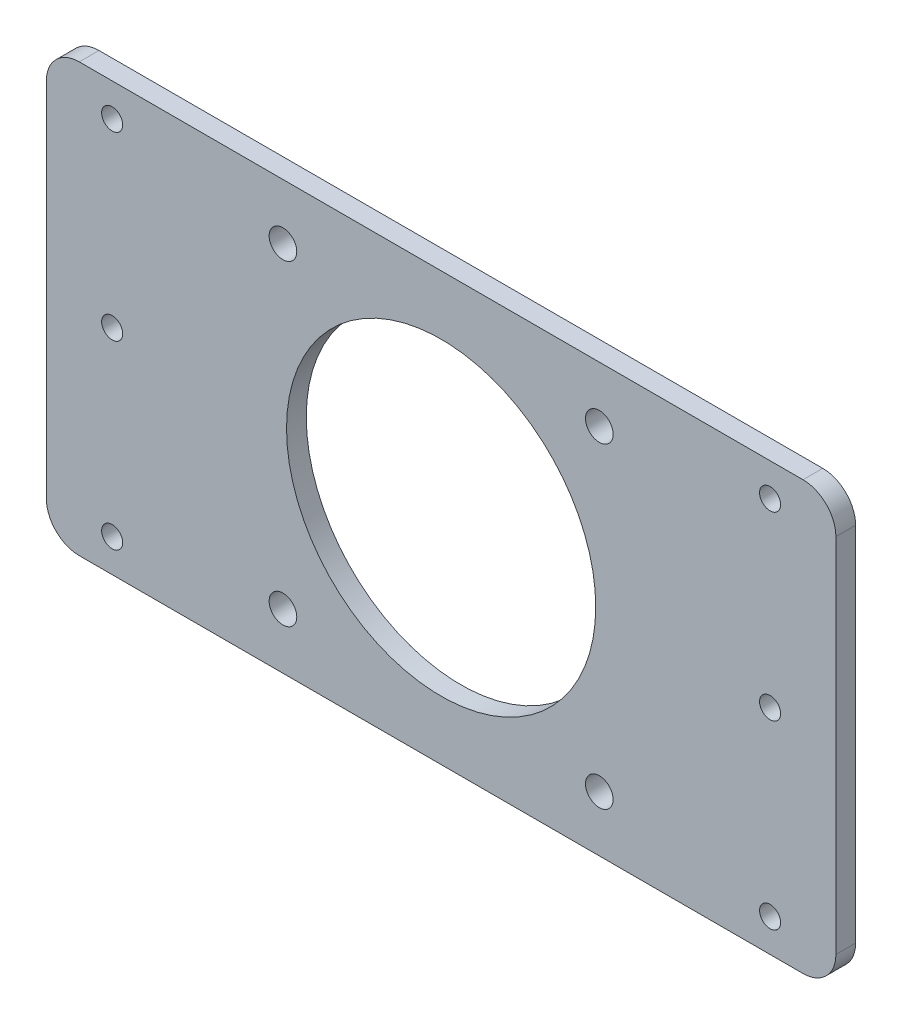
ISO-10303-21;
HEADER;
FILE_DESCRIPTION(('STEP AP214'),'2;1');
FILE_NAME('part.step','',(''),(''),'','','');
FILE_SCHEMA(('AUTOMOTIVE_DESIGN { 1 0 10303 214 1 1 1 1 }'));
ENDSEC;
DATA;
#1=APPLICATION_CONTEXT('core data for automotive mechanical design processes');
#2=APPLICATION_PROTOCOL_DEFINITION('international standard','automotive_design',2000,#1);
#3=PRODUCT_CONTEXT('',#1,'mechanical');
#4=PRODUCT('Part','Part','',(#3));
#5=PRODUCT_RELATED_PRODUCT_CATEGORY('part','',(#4));
#6=PRODUCT_DEFINITION_FORMATION('','',#4);
#7=PRODUCT_DEFINITION_CONTEXT('part definition',#1,'design');
#8=PRODUCT_DEFINITION('design','',#6,#7);
#9=PRODUCT_DEFINITION_SHAPE('','',#8);
#10=(LENGTH_UNIT() NAMED_UNIT(*) SI_UNIT(.MILLI.,.METRE.));
#11=(NAMED_UNIT(*) PLANE_ANGLE_UNIT() SI_UNIT($,.RADIAN.));
#12=(NAMED_UNIT(*) SI_UNIT($,.STERADIAN.) SOLID_ANGLE_UNIT());
#13=UNCERTAINTY_MEASURE_WITH_UNIT(LENGTH_MEASURE(1.E-05),#10,'distance_accuracy_value','');
#14=(GEOMETRIC_REPRESENTATION_CONTEXT(3) GLOBAL_UNCERTAINTY_ASSIGNED_CONTEXT((#13)) GLOBAL_UNIT_ASSIGNED_CONTEXT((#10,
#11,#12)) REPRESENTATION_CONTEXT('',''));
#15=CARTESIAN_POINT('',(0.,0.,0.));
#16=DIRECTION('',(0.,0.,1.));
#17=DIRECTION('',(1.,0.,0.));
#18=AXIS2_PLACEMENT_3D('',#15,#16,#17);
#19=CARTESIAN_POINT('',(0.,0.,3.));
#20=DIRECTION('',(1.,0.,0.));
#21=DIRECTION('',(0.,0.,-1.));
#22=AXIS2_PLACEMENT_3D('',#19,#20,#21);
#23=PLANE('',#22);
#24=DIRECTION('',(0.,-1.,0.));
#25=VECTOR('',#24,1.);
#26=CARTESIAN_POINT('',(0.,0.,0.));
#27=LINE('',#26,#25);
#28=CARTESIAN_POINT('',(0.,-5.,0.));
#29=VERTEX_POINT('',#28);
#30=CARTESIAN_POINT('',(0.,-60.,0.));
#31=VERTEX_POINT('',#30);
#32=EDGE_CURVE('E228',#29,#31,#27,.T.);
#33=ORIENTED_EDGE('',*,*,#32,.T.);
#34=DIRECTION('',(0.,0.,-1.));
#35=VECTOR('',#34,1.);
#36=CARTESIAN_POINT('',(0.,-60.,3.));
#37=LINE('',#36,#35);
#38=CARTESIAN_POINT('',(0.,-60.,3.));
#39=VERTEX_POINT('',#38);
#40=EDGE_CURVE('E11',#31,#39,#37,.F.);
#41=ORIENTED_EDGE('',*,*,#40,.T.);
#42=DIRECTION('',(0.,-1.,0.));
#43=VECTOR('',#42,1.);
#44=CARTESIAN_POINT('',(0.,0.,3.));
#45=LINE('',#44,#43);
#46=CARTESIAN_POINT('',(0.,-5.,3.));
#47=VERTEX_POINT('',#46);
#48=EDGE_CURVE('E135',#47,#39,#45,.T.);
#49=ORIENTED_EDGE('',*,*,#48,.F.);
#50=DIRECTION('',(0.,0.,-1.));
#51=VECTOR('',#50,1.);
#52=CARTESIAN_POINT('',(0.,-5.,3.));
#53=LINE('',#52,#51);
#54=EDGE_CURVE('E50',#47,#29,#53,.T.);
#55=ORIENTED_EDGE('',*,*,#54,.T.);
#56=EDGE_LOOP('',(#33,#41,#49,#55));
#57=FACE_BOUND('',#56,.T.);
#58=ADVANCED_FACE('F41',(#57),#23,.F.);
#59=CARTESIAN_POINT('',(0.,-65.,3.));
#60=DIRECTION('',(0.,1.,0.));
#61=DIRECTION('',(0.,0.,1.));
#62=AXIS2_PLACEMENT_3D('',#59,#60,#61);
#63=PLANE('',#62);
#64=DIRECTION('',(1.,0.,0.));
#65=VECTOR('',#64,1.);
#66=CARTESIAN_POINT('',(0.,-65.,0.));
#67=LINE('',#66,#65);
#68=CARTESIAN_POINT('',(5.,-65.,0.));
#69=VERTEX_POINT('',#68);
#70=CARTESIAN_POINT('',(115.,-65.,0.));
#71=VERTEX_POINT('',#70);
#72=EDGE_CURVE('E140',#69,#71,#67,.T.);
#73=ORIENTED_EDGE('',*,*,#72,.T.);
#74=DIRECTION('',(0.,0.,-1.));
#75=VECTOR('',#74,1.);
#76=CARTESIAN_POINT('',(115.,-65.,3.));
#77=LINE('',#76,#75);
#78=CARTESIAN_POINT('',(115.,-65.,3.));
#79=VERTEX_POINT('',#78);
#80=EDGE_CURVE('E58',#71,#79,#77,.F.);
#81=ORIENTED_EDGE('',*,*,#80,.T.);
#82=DIRECTION('',(1.,0.,0.));
#83=VECTOR('',#82,1.);
#84=CARTESIAN_POINT('',(0.,-65.,3.));
#85=LINE('',#84,#83);
#86=CARTESIAN_POINT('',(5.,-65.,3.));
#87=VERTEX_POINT('',#86);
#88=EDGE_CURVE('E138',#87,#79,#85,.T.);
#89=ORIENTED_EDGE('',*,*,#88,.F.);
#90=DIRECTION('',(0.,0.,-1.));
#91=VECTOR('',#90,1.);
#92=CARTESIAN_POINT('',(5.,-65.,3.));
#93=LINE('',#92,#91);
#94=EDGE_CURVE('E159',#87,#69,#93,.T.);
#95=ORIENTED_EDGE('',*,*,#94,.T.);
#96=EDGE_LOOP('',(#73,#81,#89,#95));
#97=FACE_BOUND('',#96,.T.);
#98=ADVANCED_FACE('F238',(#97),#63,.F.);
#99=CARTESIAN_POINT('',(120.,0.,3.));
#100=DIRECTION('',(-1.,0.,0.));
#101=DIRECTION('',(0.,-1.,0.));
#102=AXIS2_PLACEMENT_3D('',#99,#100,#101);
#103=PLANE('',#102);
#104=DIRECTION('',(0.,1.,0.));
#105=VECTOR('',#104,1.);
#106=CARTESIAN_POINT('',(120.,0.,0.));
#107=LINE('',#106,#105);
#108=CARTESIAN_POINT('',(120.,-60.,0.));
#109=VERTEX_POINT('',#108);
#110=CARTESIAN_POINT('',(120.,-5.,0.));
#111=VERTEX_POINT('',#110);
#112=EDGE_CURVE('E136',#109,#111,#107,.T.);
#113=ORIENTED_EDGE('',*,*,#112,.T.);
#114=DIRECTION('',(0.,0.,-1.));
#115=VECTOR('',#114,1.);
#116=CARTESIAN_POINT('',(120.,-5.,3.));
#117=LINE('',#116,#115);
#118=CARTESIAN_POINT('',(120.,-5.,3.));
#119=VERTEX_POINT('',#118);
#120=EDGE_CURVE('E114',#111,#119,#117,.F.);
#121=ORIENTED_EDGE('',*,*,#120,.T.);
#122=DIRECTION('',(0.,1.,0.));
#123=VECTOR('',#122,1.);
#124=CARTESIAN_POINT('',(120.,0.,3.));
#125=LINE('',#124,#123);
#126=CARTESIAN_POINT('',(120.,-60.,3.));
#127=VERTEX_POINT('',#126);
#128=EDGE_CURVE('E232',#127,#119,#125,.T.);
#129=ORIENTED_EDGE('',*,*,#128,.F.);
#130=DIRECTION('',(0.,0.,-1.));
#131=VECTOR('',#130,1.);
#132=CARTESIAN_POINT('',(120.,-60.,3.));
#133=LINE('',#132,#131);
#134=EDGE_CURVE('E119',#127,#109,#133,.T.);
#135=ORIENTED_EDGE('',*,*,#134,.T.);
#136=EDGE_LOOP('',(#113,#121,#129,#135));
#137=FACE_BOUND('',#136,.T.);
#138=ADVANCED_FACE('F247',(#137),#103,.F.);
#139=CARTESIAN_POINT('',(0.,0.,3.));
#140=DIRECTION('',(0.,-1.,0.));
#141=DIRECTION('',(0.,0.,-1.));
#142=AXIS2_PLACEMENT_3D('',#139,#140,#141);
#143=PLANE('',#142);
#144=DIRECTION('',(-1.,0.,0.));
#145=VECTOR('',#144,1.);
#146=CARTESIAN_POINT('',(0.,0.,3.));
#147=LINE('',#146,#145);
#148=CARTESIAN_POINT('',(115.,0.,3.));
#149=VERTEX_POINT('',#148);
#150=CARTESIAN_POINT('',(5.,0.,3.));
#151=VERTEX_POINT('',#150);
#152=EDGE_CURVE('E129',#149,#151,#147,.T.);
#153=ORIENTED_EDGE('',*,*,#152,.F.);
#154=DIRECTION('',(0.,0.,-1.));
#155=VECTOR('',#154,1.);
#156=CARTESIAN_POINT('',(115.,0.,3.));
#157=LINE('',#156,#155);
#158=CARTESIAN_POINT('',(115.,0.,0.));
#159=VERTEX_POINT('',#158);
#160=EDGE_CURVE('E113',#149,#159,#157,.T.);
#161=ORIENTED_EDGE('',*,*,#160,.T.);
#162=DIRECTION('',(-1.,0.,0.));
#163=VECTOR('',#162,1.);
#164=CARTESIAN_POINT('',(0.,0.,0.));
#165=LINE('',#164,#163);
#166=CARTESIAN_POINT('',(5.,0.,0.));
#167=VERTEX_POINT('',#166);
#168=EDGE_CURVE('E126',#159,#167,#165,.T.);
#169=ORIENTED_EDGE('',*,*,#168,.T.);
#170=DIRECTION('',(0.,0.,-1.));
#171=VECTOR('',#170,1.);
#172=CARTESIAN_POINT('',(5.,0.,3.));
#173=LINE('',#172,#171);
#174=EDGE_CURVE('E131',#167,#151,#173,.F.);
#175=ORIENTED_EDGE('',*,*,#174,.T.);
#176=EDGE_LOOP('',(#153,#161,#169,#175));
#177=FACE_BOUND('',#176,.T.);
#178=ADVANCED_FACE('F125',(#177),#143,.F.);
#179=CARTESIAN_POINT('',(0.,0.,3.));
#180=DIRECTION('',(0.,0.,1.));
#181=DIRECTION('',(1.,0.,0.));
#182=AXIS2_PLACEMENT_3D('',#179,#180,#181);
#183=PLANE('',#182);
#184=CARTESIAN_POINT('',(35.9583694396573,-8.45836943965745,3.));
#185=DIRECTION('',(0.,0.,1.));
#186=DIRECTION('',(1.,0.,0.));
#187=AXIS2_PLACEMENT_3D('',#184,#185,#186);
#188=CIRCLE('',#187,2.1);
#189=CARTESIAN_POINT('',(38.0583694396573,-8.45836943965745,3.));
#190=VERTEX_POINT('',#189);
#191=EDGE_CURVE('E190',#190,#190,#188,.T.);
#192=ORIENTED_EDGE('',*,*,#191,.F.);
#193=EDGE_LOOP('',(#192));
#194=FACE_BOUND('',#193,.T.);
#195=CARTESIAN_POINT('',(35.9583694396574,-56.5416305603427,3.));
#196=DIRECTION('',(0.,0.,1.));
#197=DIRECTION('',(1.,0.,0.));
#198=AXIS2_PLACEMENT_3D('',#195,#196,#197);
#199=CIRCLE('',#198,2.1);
#200=CARTESIAN_POINT('',(38.0583694396574,-56.5416305603427,3.));
#201=VERTEX_POINT('',#200);
#202=EDGE_CURVE('E179',#201,#201,#199,.T.);
#203=ORIENTED_EDGE('',*,*,#202,.F.);
#204=EDGE_LOOP('',(#203));
#205=FACE_BOUND('',#204,.T.);
#206=CARTESIAN_POINT('',(84.0416305603427,-56.5416305603426,3.));
#207=DIRECTION('',(0.,0.,1.));
#208=DIRECTION('',(1.,0.,0.));
#209=AXIS2_PLACEMENT_3D('',#206,#207,#208);
#210=CIRCLE('',#209,2.1);
#211=CARTESIAN_POINT('',(86.1416305603427,-56.5416305603426,3.));
#212=VERTEX_POINT('',#211);
#213=EDGE_CURVE('E176',#212,#212,#210,.T.);
#214=ORIENTED_EDGE('',*,*,#213,.F.);
#215=EDGE_LOOP('',(#214));
#216=FACE_BOUND('',#215,.T.);
#217=CARTESIAN_POINT('',(84.0416305603426,-8.45836943965735,3.));
#218=DIRECTION('',(0.,0.,1.));
#219=DIRECTION('',(1.,0.,0.));
#220=AXIS2_PLACEMENT_3D('',#217,#218,#219);
#221=CIRCLE('',#220,2.10000000000002);
#222=CARTESIAN_POINT('',(86.1416305603426,-8.45836943965735,3.));
#223=VERTEX_POINT('',#222);
#224=EDGE_CURVE('E173',#223,#223,#221,.T.);
#225=ORIENTED_EDGE('',*,*,#224,.F.);
#226=EDGE_LOOP('',(#225));
#227=FACE_BOUND('',#226,.T.);
#228=CARTESIAN_POINT('',(60.,-32.5,3.));
#229=DIRECTION('',(0.,0.,1.));
#230=DIRECTION('',(1.,0.,0.));
#231=AXIS2_PLACEMENT_3D('',#228,#229,#230);
#232=CIRCLE('',#231,23.5);
#233=CARTESIAN_POINT('',(83.5,-32.5,3.));
#234=VERTEX_POINT('',#233);
#235=EDGE_CURVE('E169',#234,#234,#232,.T.);
#236=ORIENTED_EDGE('',*,*,#235,.F.);
#237=EDGE_LOOP('',(#236));
#238=FACE_BOUND('',#237,.T.);
#239=CARTESIAN_POINT('',(110.,-5.00000000000001,3.));
#240=DIRECTION('',(0.,0.,1.));
#241=DIRECTION('',(-1.,0.,0.));
#242=AXIS2_PLACEMENT_3D('',#239,#240,#241);
#243=CIRCLE('',#242,1.59999999999999);
#244=CARTESIAN_POINT('',(108.4,-5.00000000000001,3.));
#245=VERTEX_POINT('',#244);
#246=EDGE_CURVE('E220',#245,#245,#243,.T.);
#247=ORIENTED_EDGE('',*,*,#246,.F.);
#248=EDGE_LOOP('',(#247));
#249=FACE_BOUND('',#248,.T.);
#250=CARTESIAN_POINT('',(110.,-32.5,3.));
#251=DIRECTION('',(0.,0.,1.));
#252=DIRECTION('',(-1.,0.,0.));
#253=AXIS2_PLACEMENT_3D('',#250,#251,#252);
#254=CIRCLE('',#253,1.59999999999999);
#255=CARTESIAN_POINT('',(108.4,-32.5,3.));
#256=VERTEX_POINT('',#255);
#257=EDGE_CURVE('E214',#256,#256,#254,.T.);
#258=ORIENTED_EDGE('',*,*,#257,.F.);
#259=EDGE_LOOP('',(#258));
#260=FACE_BOUND('',#259,.T.);
#261=CARTESIAN_POINT('',(110.,-60.,3.));
#262=DIRECTION('',(0.,0.,1.));
#263=DIRECTION('',(-1.,0.,0.));
#264=AXIS2_PLACEMENT_3D('',#261,#262,#263);
#265=CIRCLE('',#264,1.6);
#266=CARTESIAN_POINT('',(108.4,-60.,3.));
#267=VERTEX_POINT('',#266);
#268=EDGE_CURVE('E208',#267,#267,#265,.T.);
#269=ORIENTED_EDGE('',*,*,#268,.F.);
#270=EDGE_LOOP('',(#269));
#271=FACE_BOUND('',#270,.T.);
#272=CARTESIAN_POINT('',(10.,-60.,3.));
#273=DIRECTION('',(0.,0.,1.));
#274=DIRECTION('',(1.,0.,0.));
#275=AXIS2_PLACEMENT_3D('',#272,#273,#274);
#276=CIRCLE('',#275,1.6);
#277=CARTESIAN_POINT('',(11.6,-60.,3.));
#278=VERTEX_POINT('',#277);
#279=EDGE_CURVE('E202',#278,#278,#276,.T.);
#280=ORIENTED_EDGE('',*,*,#279,.F.);
#281=EDGE_LOOP('',(#280));
#282=FACE_BOUND('',#281,.T.);
#283=CARTESIAN_POINT('',(10.,-32.5,3.));
#284=DIRECTION('',(0.,0.,1.));
#285=DIRECTION('',(1.,0.,0.));
#286=AXIS2_PLACEMENT_3D('',#283,#284,#285);
#287=CIRCLE('',#286,1.6);
#288=CARTESIAN_POINT('',(11.6,-32.5,3.));
#289=VERTEX_POINT('',#288);
#290=EDGE_CURVE('E195',#289,#289,#287,.T.);
#291=ORIENTED_EDGE('',*,*,#290,.F.);
#292=EDGE_LOOP('',(#291));
#293=FACE_BOUND('',#292,.T.);
#294=CARTESIAN_POINT('',(10.,-5.,3.));
#295=DIRECTION('',(0.,0.,1.));
#296=DIRECTION('',(1.,0.,0.));
#297=AXIS2_PLACEMENT_3D('',#294,#295,#296);
#298=CIRCLE('',#297,1.6);
#299=CARTESIAN_POINT('',(11.6,-5.,3.));
#300=VERTEX_POINT('',#299);
#301=EDGE_CURVE('E198',#300,#300,#298,.T.);
#302=ORIENTED_EDGE('',*,*,#301,.F.);
#303=EDGE_LOOP('',(#302));
#304=FACE_BOUND('',#303,.T.);
#305=ORIENTED_EDGE('',*,*,#128,.T.);
#306=CARTESIAN_POINT('',(115.,-5.,3.));
#307=DIRECTION('',(0.,0.,1.));
#308=DIRECTION('',(1.,0.,0.));
#309=AXIS2_PLACEMENT_3D('',#306,#307,#308);
#310=CIRCLE('',#309,5.);
#311=EDGE_CURVE('E157',#119,#149,#310,.T.);
#312=ORIENTED_EDGE('',*,*,#311,.T.);
#313=ORIENTED_EDGE('',*,*,#152,.T.);
#314=CARTESIAN_POINT('',(5.,-5.,3.));
#315=DIRECTION('',(0.,0.,1.));
#316=DIRECTION('',(1.,0.,0.));
#317=AXIS2_PLACEMENT_3D('',#314,#315,#316);
#318=CIRCLE('',#317,5.);
#319=EDGE_CURVE('E152',#151,#47,#318,.T.);
#320=ORIENTED_EDGE('',*,*,#319,.T.);
#321=ORIENTED_EDGE('',*,*,#48,.T.);
#322=CARTESIAN_POINT('',(5.,-60.,3.));
#323=DIRECTION('',(0.,0.,1.));
#324=DIRECTION('',(1.,0.,0.));
#325=AXIS2_PLACEMENT_3D('',#322,#323,#324);
#326=CIRCLE('',#325,5.);
#327=EDGE_CURVE('E65',#39,#87,#326,.T.);
#328=ORIENTED_EDGE('',*,*,#327,.T.);
#329=ORIENTED_EDGE('',*,*,#88,.T.);
#330=CARTESIAN_POINT('',(115.,-60.,3.));
#331=DIRECTION('',(0.,0.,1.));
#332=DIRECTION('',(1.,0.,0.));
#333=AXIS2_PLACEMENT_3D('',#330,#331,#332);
#334=CIRCLE('',#333,5.);
#335=EDGE_CURVE('E155',#79,#127,#334,.T.);
#336=ORIENTED_EDGE('',*,*,#335,.T.);
#337=EDGE_LOOP('',(#305,#312,#313,#320,#321,#328,#329,#336));
#338=FACE_BOUND('',#337,.T.);
#339=ADVANCED_FACE('F245',(#194,#205,#216,#227,#238,#249,#260,#271,#282,#293,#304,#338),#183,.T.);
#340=CARTESIAN_POINT('',(0.,0.,0.));
#341=DIRECTION('',(0.,0.,1.));
#342=DIRECTION('',(1.,0.,0.));
#343=AXIS2_PLACEMENT_3D('',#340,#341,#342);
#344=PLANE('',#343);
#345=CARTESIAN_POINT('',(35.9583694396573,-8.45836943965745,0.));
#346=DIRECTION('',(0.,0.,1.));
#347=DIRECTION('',(1.,0.,0.));
#348=AXIS2_PLACEMENT_3D('',#345,#346,#347);
#349=CIRCLE('',#348,2.1);
#350=CARTESIAN_POINT('',(38.0583694396573,-8.45836943965745,0.));
#351=VERTEX_POINT('',#350);
#352=EDGE_CURVE('E45',#351,#351,#349,.T.);
#353=ORIENTED_EDGE('',*,*,#352,.T.);
#354=EDGE_LOOP('',(#353));
#355=FACE_BOUND('',#354,.T.);
#356=CARTESIAN_POINT('',(35.9583694396574,-56.5416305603427,0.));
#357=DIRECTION('',(0.,0.,1.));
#358=DIRECTION('',(1.,0.,0.));
#359=AXIS2_PLACEMENT_3D('',#356,#357,#358);
#360=CIRCLE('',#359,2.1);
#361=CARTESIAN_POINT('',(38.0583694396574,-56.5416305603427,0.));
#362=VERTEX_POINT('',#361);
#363=EDGE_CURVE('E177',#362,#362,#360,.T.);
#364=ORIENTED_EDGE('',*,*,#363,.T.);
#365=EDGE_LOOP('',(#364));
#366=FACE_BOUND('',#365,.T.);
#367=CARTESIAN_POINT('',(84.0416305603427,-56.5416305603426,0.));
#368=DIRECTION('',(0.,0.,1.));
#369=DIRECTION('',(1.,0.,0.));
#370=AXIS2_PLACEMENT_3D('',#367,#368,#369);
#371=CIRCLE('',#370,2.1);
#372=CARTESIAN_POINT('',(86.1416305603427,-56.5416305603426,0.));
#373=VERTEX_POINT('',#372);
#374=EDGE_CURVE('E174',#373,#373,#371,.T.);
#375=ORIENTED_EDGE('',*,*,#374,.T.);
#376=EDGE_LOOP('',(#375));
#377=FACE_BOUND('',#376,.T.);
#378=CARTESIAN_POINT('',(84.0416305603426,-8.45836943965735,0.));
#379=DIRECTION('',(0.,0.,1.));
#380=DIRECTION('',(1.,0.,0.));
#381=AXIS2_PLACEMENT_3D('',#378,#379,#380);
#382=CIRCLE('',#381,2.10000000000002);
#383=CARTESIAN_POINT('',(86.1416305603426,-8.45836943965735,0.));
#384=VERTEX_POINT('',#383);
#385=EDGE_CURVE('E170',#384,#384,#382,.T.);
#386=ORIENTED_EDGE('',*,*,#385,.T.);
#387=EDGE_LOOP('',(#386));
#388=FACE_BOUND('',#387,.T.);
#389=CARTESIAN_POINT('',(60.,-32.5,0.));
#390=DIRECTION('',(0.,0.,1.));
#391=DIRECTION('',(1.,0.,0.));
#392=AXIS2_PLACEMENT_3D('',#389,#390,#391);
#393=CIRCLE('',#392,23.5);
#394=CARTESIAN_POINT('',(83.5,-32.5,0.));
#395=VERTEX_POINT('',#394);
#396=EDGE_CURVE('E165',#395,#395,#393,.T.);
#397=ORIENTED_EDGE('',*,*,#396,.T.);
#398=EDGE_LOOP('',(#397));
#399=FACE_BOUND('',#398,.T.);
#400=CARTESIAN_POINT('',(110.,-5.00000000000001,0.));
#401=DIRECTION('',(0.,0.,1.));
#402=DIRECTION('',(-1.,0.,0.));
#403=AXIS2_PLACEMENT_3D('',#400,#401,#402);
#404=CIRCLE('',#403,1.59999999999999);
#405=CARTESIAN_POINT('',(108.4,-5.00000000000001,0.));
#406=VERTEX_POINT('',#405);
#407=EDGE_CURVE('E168',#406,#406,#404,.T.);
#408=ORIENTED_EDGE('',*,*,#407,.T.);
#409=EDGE_LOOP('',(#408));
#410=FACE_BOUND('',#409,.T.);
#411=CARTESIAN_POINT('',(110.,-32.5,0.));
#412=DIRECTION('',(0.,0.,1.));
#413=DIRECTION('',(-1.,0.,0.));
#414=AXIS2_PLACEMENT_3D('',#411,#412,#413);
#415=CIRCLE('',#414,1.59999999999999);
#416=CARTESIAN_POINT('',(108.4,-32.5,0.));
#417=VERTEX_POINT('',#416);
#418=EDGE_CURVE('E217',#417,#417,#415,.T.);
#419=ORIENTED_EDGE('',*,*,#418,.T.);
#420=EDGE_LOOP('',(#419));
#421=FACE_BOUND('',#420,.T.);
#422=CARTESIAN_POINT('',(110.,-60.,0.));
#423=DIRECTION('',(0.,0.,1.));
#424=DIRECTION('',(-1.,0.,0.));
#425=AXIS2_PLACEMENT_3D('',#422,#423,#424);
#426=CIRCLE('',#425,1.6);
#427=CARTESIAN_POINT('',(108.4,-60.,0.));
#428=VERTEX_POINT('',#427);
#429=EDGE_CURVE('E211',#428,#428,#426,.T.);
#430=ORIENTED_EDGE('',*,*,#429,.T.);
#431=EDGE_LOOP('',(#430));
#432=FACE_BOUND('',#431,.T.);
#433=CARTESIAN_POINT('',(10.,-60.,0.));
#434=DIRECTION('',(0.,0.,1.));
#435=DIRECTION('',(1.,0.,0.));
#436=AXIS2_PLACEMENT_3D('',#433,#434,#435);
#437=CIRCLE('',#436,1.6);
#438=CARTESIAN_POINT('',(11.6,-60.,0.));
#439=VERTEX_POINT('',#438);
#440=EDGE_CURVE('E205',#439,#439,#437,.T.);
#441=ORIENTED_EDGE('',*,*,#440,.T.);
#442=EDGE_LOOP('',(#441));
#443=FACE_BOUND('',#442,.T.);
#444=CARTESIAN_POINT('',(10.,-32.5,0.));
#445=DIRECTION('',(0.,0.,1.));
#446=DIRECTION('',(1.,0.,0.));
#447=AXIS2_PLACEMENT_3D('',#444,#445,#446);
#448=CIRCLE('',#447,1.6);
#449=CARTESIAN_POINT('',(11.6,-32.5,0.));
#450=VERTEX_POINT('',#449);
#451=EDGE_CURVE('E199',#450,#450,#448,.T.);
#452=ORIENTED_EDGE('',*,*,#451,.T.);
#453=EDGE_LOOP('',(#452));
#454=FACE_BOUND('',#453,.T.);
#455=CARTESIAN_POINT('',(10.,-5.,0.));
#456=DIRECTION('',(0.,0.,1.));
#457=DIRECTION('',(1.,0.,0.));
#458=AXIS2_PLACEMENT_3D('',#455,#456,#457);
#459=CIRCLE('',#458,1.6);
#460=CARTESIAN_POINT('',(11.6,-5.,0.));
#461=VERTEX_POINT('',#460);
#462=EDGE_CURVE('E225',#461,#461,#459,.T.);
#463=ORIENTED_EDGE('',*,*,#462,.T.);
#464=EDGE_LOOP('',(#463));
#465=FACE_BOUND('',#464,.T.);
#466=ORIENTED_EDGE('',*,*,#168,.F.);
#467=CARTESIAN_POINT('',(115.,-5.,0.));
#468=DIRECTION('',(0.,0.,1.));
#469=DIRECTION('',(1.,0.,0.));
#470=AXIS2_PLACEMENT_3D('',#467,#468,#469);
#471=CIRCLE('',#470,5.);
#472=EDGE_CURVE('E109',#159,#111,#471,.F.);
#473=ORIENTED_EDGE('',*,*,#472,.T.);
#474=ORIENTED_EDGE('',*,*,#112,.F.);
#475=CARTESIAN_POINT('',(115.,-60.,0.));
#476=DIRECTION('',(0.,0.,1.));
#477=DIRECTION('',(1.,0.,0.));
#478=AXIS2_PLACEMENT_3D('',#475,#476,#477);
#479=CIRCLE('',#478,5.);
#480=EDGE_CURVE('E120',#109,#71,#479,.F.);
#481=ORIENTED_EDGE('',*,*,#480,.T.);
#482=ORIENTED_EDGE('',*,*,#72,.F.);
#483=CARTESIAN_POINT('',(5.,-60.,0.));
#484=DIRECTION('',(0.,0.,1.));
#485=DIRECTION('',(1.,0.,0.));
#486=AXIS2_PLACEMENT_3D('',#483,#484,#485);
#487=CIRCLE('',#486,5.);
#488=EDGE_CURVE('E146',#69,#31,#487,.F.);
#489=ORIENTED_EDGE('',*,*,#488,.T.);
#490=ORIENTED_EDGE('',*,*,#32,.F.);
#491=CARTESIAN_POINT('',(5.,-5.,0.));
#492=DIRECTION('',(0.,0.,1.));
#493=DIRECTION('',(1.,0.,0.));
#494=AXIS2_PLACEMENT_3D('',#491,#492,#493);
#495=CIRCLE('',#494,5.);
#496=EDGE_CURVE('E130',#29,#167,#495,.F.);
#497=ORIENTED_EDGE('',*,*,#496,.T.);
#498=EDGE_LOOP('',(#466,#473,#474,#481,#482,#489,#490,#497));
#499=FACE_BOUND('',#498,.T.);
#500=ADVANCED_FACE('F133',(#355,#366,#377,#388,#399,#410,#421,#432,#443,#454,#465,#499),#344,.F.);
#501=CARTESIAN_POINT('',(10.,-5.,0.));
#502=DIRECTION('',(0.,0.,1.));
#503=DIRECTION('',(1.,0.,0.));
#504=AXIS2_PLACEMENT_3D('',#501,#502,#503);
#505=CYLINDRICAL_SURFACE('',#504,1.6);
#506=ORIENTED_EDGE('',*,*,#462,.F.);
#507=EDGE_LOOP('',(#506));
#508=FACE_BOUND('',#507,.T.);
#509=ORIENTED_EDGE('',*,*,#301,.T.);
#510=EDGE_LOOP('',(#509));
#511=FACE_BOUND('',#510,.T.);
#512=ADVANCED_FACE('F299',(#508,#511),#505,.F.);
#513=CARTESIAN_POINT('',(10.,-32.5,0.));
#514=DIRECTION('',(0.,0.,1.));
#515=DIRECTION('',(1.,0.,0.));
#516=AXIS2_PLACEMENT_3D('',#513,#514,#515);
#517=CYLINDRICAL_SURFACE('',#516,1.6);
#518=ORIENTED_EDGE('',*,*,#451,.F.);
#519=EDGE_LOOP('',(#518));
#520=FACE_BOUND('',#519,.T.);
#521=ORIENTED_EDGE('',*,*,#290,.T.);
#522=EDGE_LOOP('',(#521));
#523=FACE_BOUND('',#522,.T.);
#524=ADVANCED_FACE('F295',(#520,#523),#517,.F.);
#525=CARTESIAN_POINT('',(10.,-60.,0.));
#526=DIRECTION('',(0.,0.,1.));
#527=DIRECTION('',(1.,0.,0.));
#528=AXIS2_PLACEMENT_3D('',#525,#526,#527);
#529=CYLINDRICAL_SURFACE('',#528,1.6);
#530=ORIENTED_EDGE('',*,*,#440,.F.);
#531=EDGE_LOOP('',(#530));
#532=FACE_BOUND('',#531,.T.);
#533=ORIENTED_EDGE('',*,*,#279,.T.);
#534=EDGE_LOOP('',(#533));
#535=FACE_BOUND('',#534,.T.);
#536=ADVANCED_FACE('F298',(#532,#535),#529,.F.);
#537=CARTESIAN_POINT('',(110.,-60.,0.));
#538=DIRECTION('',(0.,0.,1.));
#539=DIRECTION('',(1.,0.,0.));
#540=AXIS2_PLACEMENT_3D('',#537,#538,#539);
#541=CYLINDRICAL_SURFACE('',#540,1.6);
#542=ORIENTED_EDGE('',*,*,#429,.F.);
#543=EDGE_LOOP('',(#542));
#544=FACE_BOUND('',#543,.T.);
#545=ORIENTED_EDGE('',*,*,#268,.T.);
#546=EDGE_LOOP('',(#545));
#547=FACE_BOUND('',#546,.T.);
#548=ADVANCED_FACE('F303',(#544,#547),#541,.F.);
#549=CARTESIAN_POINT('',(110.,-32.5,0.));
#550=DIRECTION('',(0.,0.,1.));
#551=DIRECTION('',(1.,0.,0.));
#552=AXIS2_PLACEMENT_3D('',#549,#550,#551);
#553=CYLINDRICAL_SURFACE('',#552,1.59999999999999);
#554=ORIENTED_EDGE('',*,*,#418,.F.);
#555=EDGE_LOOP('',(#554));
#556=FACE_BOUND('',#555,.T.);
#557=ORIENTED_EDGE('',*,*,#257,.T.);
#558=EDGE_LOOP('',(#557));
#559=FACE_BOUND('',#558,.T.);
#560=ADVANCED_FACE('F307',(#556,#559),#553,.F.);
#561=CARTESIAN_POINT('',(110.,-5.00000000000001,0.));
#562=DIRECTION('',(0.,0.,1.));
#563=DIRECTION('',(1.,0.,0.));
#564=AXIS2_PLACEMENT_3D('',#561,#562,#563);
#565=CYLINDRICAL_SURFACE('',#564,1.59999999999999);
#566=ORIENTED_EDGE('',*,*,#407,.F.);
#567=EDGE_LOOP('',(#566));
#568=FACE_BOUND('',#567,.T.);
#569=ORIENTED_EDGE('',*,*,#246,.T.);
#570=EDGE_LOOP('',(#569));
#571=FACE_BOUND('',#570,.T.);
#572=ADVANCED_FACE('F265',(#568,#571),#565,.F.);
#573=CARTESIAN_POINT('',(115.,-5.,3.));
#574=DIRECTION('',(0.,0.,-1.));
#575=DIRECTION('',(-1.,0.,0.));
#576=AXIS2_PLACEMENT_3D('',#573,#574,#575);
#577=CYLINDRICAL_SURFACE('',#576,5.);
#578=ORIENTED_EDGE('',*,*,#311,.F.);
#579=ORIENTED_EDGE('',*,*,#120,.F.);
#580=ORIENTED_EDGE('',*,*,#472,.F.);
#581=ORIENTED_EDGE('',*,*,#160,.F.);
#582=EDGE_LOOP('',(#578,#579,#580,#581));
#583=FACE_BOUND('',#582,.T.);
#584=ADVANCED_FACE('F112',(#583),#577,.T.);
#585=CARTESIAN_POINT('',(115.,-60.,3.));
#586=DIRECTION('',(0.,0.,-1.));
#587=DIRECTION('',(-1.,0.,0.));
#588=AXIS2_PLACEMENT_3D('',#585,#586,#587);
#589=CYLINDRICAL_SURFACE('',#588,5.);
#590=ORIENTED_EDGE('',*,*,#335,.F.);
#591=ORIENTED_EDGE('',*,*,#80,.F.);
#592=ORIENTED_EDGE('',*,*,#480,.F.);
#593=ORIENTED_EDGE('',*,*,#134,.F.);
#594=EDGE_LOOP('',(#590,#591,#592,#593));
#595=FACE_BOUND('',#594,.T.);
#596=ADVANCED_FACE('F242',(#595),#589,.T.);
#597=CARTESIAN_POINT('',(5.,-60.,3.));
#598=DIRECTION('',(0.,0.,-1.));
#599=DIRECTION('',(-1.,0.,0.));
#600=AXIS2_PLACEMENT_3D('',#597,#598,#599);
#601=CYLINDRICAL_SURFACE('',#600,5.);
#602=ORIENTED_EDGE('',*,*,#327,.F.);
#603=ORIENTED_EDGE('',*,*,#40,.F.);
#604=ORIENTED_EDGE('',*,*,#488,.F.);
#605=ORIENTED_EDGE('',*,*,#94,.F.);
#606=EDGE_LOOP('',(#602,#603,#604,#605));
#607=FACE_BOUND('',#606,.T.);
#608=ADVANCED_FACE('F267',(#607),#601,.T.);
#609=CARTESIAN_POINT('',(5.,-5.,3.));
#610=DIRECTION('',(0.,0.,-1.));
#611=DIRECTION('',(-1.,0.,0.));
#612=AXIS2_PLACEMENT_3D('',#609,#610,#611);
#613=CYLINDRICAL_SURFACE('',#612,5.);
#614=ORIENTED_EDGE('',*,*,#319,.F.);
#615=ORIENTED_EDGE('',*,*,#174,.F.);
#616=ORIENTED_EDGE('',*,*,#496,.F.);
#617=ORIENTED_EDGE('',*,*,#54,.F.);
#618=EDGE_LOOP('',(#614,#615,#616,#617));
#619=FACE_BOUND('',#618,.T.);
#620=ADVANCED_FACE('F43',(#619),#613,.T.);
#621=CARTESIAN_POINT('',(60.,-32.5,-7.));
#622=DIRECTION('',(0.,0.,1.));
#623=DIRECTION('',(1.,0.,0.));
#624=AXIS2_PLACEMENT_3D('',#621,#622,#623);
#625=CYLINDRICAL_SURFACE('',#624,23.5);
#626=ORIENTED_EDGE('',*,*,#235,.T.);
#627=EDGE_LOOP('',(#626));
#628=FACE_BOUND('',#627,.T.);
#629=ORIENTED_EDGE('',*,*,#396,.F.);
#630=EDGE_LOOP('',(#629));
#631=FACE_BOUND('',#630,.T.);
#632=ADVANCED_FACE('F273',(#628,#631),#625,.F.);
#633=CARTESIAN_POINT('',(84.0416305603426,-8.45836943965735,-2.));
#634=DIRECTION('',(0.,0.,1.));
#635=DIRECTION('',(1.,0.,0.));
#636=AXIS2_PLACEMENT_3D('',#633,#634,#635);
#637=CYLINDRICAL_SURFACE('',#636,2.10000000000002);
#638=ORIENTED_EDGE('',*,*,#224,.T.);
#639=EDGE_LOOP('',(#638));
#640=FACE_BOUND('',#639,.T.);
#641=ORIENTED_EDGE('',*,*,#385,.F.);
#642=EDGE_LOOP('',(#641));
#643=FACE_BOUND('',#642,.T.);
#644=ADVANCED_FACE('F282',(#640,#643),#637,.F.);
#645=CARTESIAN_POINT('',(84.0416305603427,-56.5416305603426,-2.));
#646=DIRECTION('',(0.,0.,1.));
#647=DIRECTION('',(1.,0.,0.));
#648=AXIS2_PLACEMENT_3D('',#645,#646,#647);
#649=CYLINDRICAL_SURFACE('',#648,2.1);
#650=ORIENTED_EDGE('',*,*,#213,.T.);
#651=EDGE_LOOP('',(#650));
#652=FACE_BOUND('',#651,.T.);
#653=ORIENTED_EDGE('',*,*,#374,.F.);
#654=EDGE_LOOP('',(#653));
#655=FACE_BOUND('',#654,.T.);
#656=ADVANCED_FACE('F289',(#652,#655),#649,.F.);
#657=CARTESIAN_POINT('',(35.9583694396574,-56.5416305603427,-2.));
#658=DIRECTION('',(0.,0.,1.));
#659=DIRECTION('',(1.,0.,0.));
#660=AXIS2_PLACEMENT_3D('',#657,#658,#659);
#661=CYLINDRICAL_SURFACE('',#660,2.1);
#662=ORIENTED_EDGE('',*,*,#202,.T.);
#663=EDGE_LOOP('',(#662));
#664=FACE_BOUND('',#663,.T.);
#665=ORIENTED_EDGE('',*,*,#363,.F.);
#666=EDGE_LOOP('',(#665));
#667=FACE_BOUND('',#666,.T.);
#668=ADVANCED_FACE('F364',(#664,#667),#661,.F.);
#669=CARTESIAN_POINT('',(35.9583694396573,-8.45836943965745,-2.));
#670=DIRECTION('',(0.,0.,1.));
#671=DIRECTION('',(1.,0.,0.));
#672=AXIS2_PLACEMENT_3D('',#669,#670,#671);
#673=CYLINDRICAL_SURFACE('',#672,2.1);
#674=ORIENTED_EDGE('',*,*,#191,.T.);
#675=EDGE_LOOP('',(#674));
#676=FACE_BOUND('',#675,.T.);
#677=ORIENTED_EDGE('',*,*,#352,.F.);
#678=EDGE_LOOP('',(#677));
#679=FACE_BOUND('',#678,.T.);
#680=ADVANCED_FACE('F369',(#676,#679),#673,.F.);
#681=CLOSED_SHELL('',(#58,#98,#138,#178,#339,#500,#512,#524,#536,#548,#560,#572,#584,#596,#608,
#620,#632,#644,#656,#668,#680));
#682=MANIFOLD_SOLID_BREP('B2',#681);
#683=ADVANCED_BREP_SHAPE_REPRESENTATION('',(#18,#682),#14);
#684=SHAPE_DEFINITION_REPRESENTATION(#9,#683);
ENDSEC;
END-ISO-10303-21;
